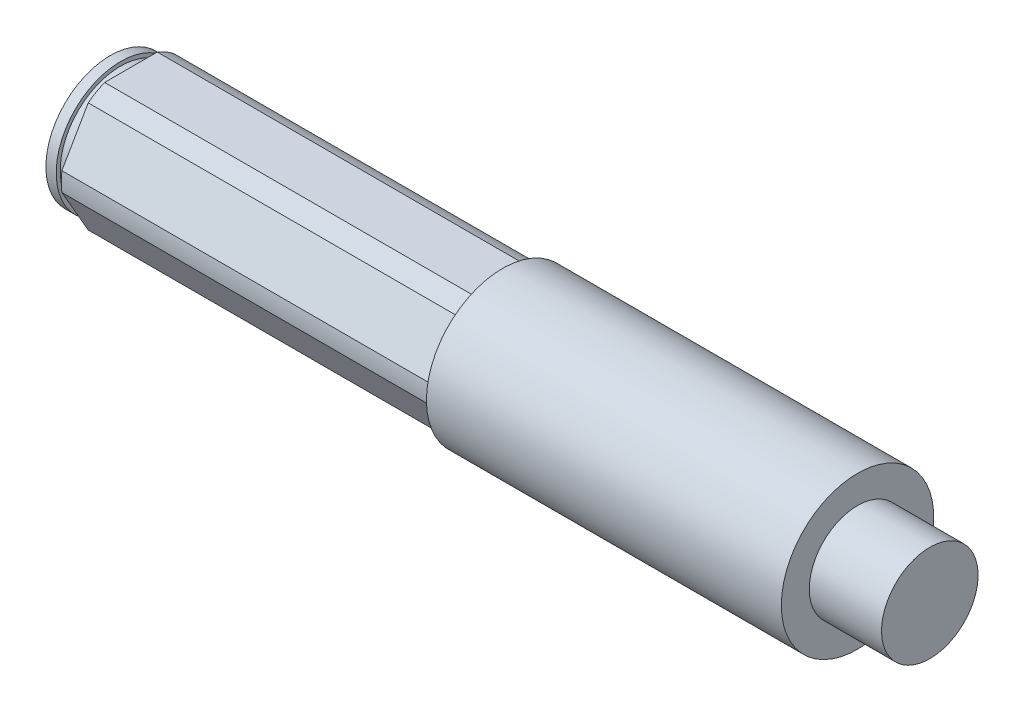
ISO-10303-21;
HEADER;
FILE_DESCRIPTION(('STEP AP214'),'2;1');
FILE_NAME('part.step','',(''),(''),'','','');
FILE_SCHEMA(('AUTOMOTIVE_DESIGN { 1 0 10303 214 1 1 1 1 }'));
ENDSEC;
DATA;
#1=APPLICATION_CONTEXT('core data for automotive mechanical design processes');
#2=APPLICATION_PROTOCOL_DEFINITION('international standard','automotive_design',2000,#1);
#3=PRODUCT_CONTEXT('',#1,'mechanical');
#4=PRODUCT('Part','Part','',(#3));
#5=PRODUCT_RELATED_PRODUCT_CATEGORY('part','',(#4));
#6=PRODUCT_DEFINITION_FORMATION('','',#4);
#7=PRODUCT_DEFINITION_CONTEXT('part definition',#1,'design');
#8=PRODUCT_DEFINITION('design','',#6,#7);
#9=PRODUCT_DEFINITION_SHAPE('','',#8);
#10=(LENGTH_UNIT() NAMED_UNIT(*) SI_UNIT(.MILLI.,.METRE.));
#11=(NAMED_UNIT(*) PLANE_ANGLE_UNIT() SI_UNIT($,.RADIAN.));
#12=(NAMED_UNIT(*) SI_UNIT($,.STERADIAN.) SOLID_ANGLE_UNIT());
#13=UNCERTAINTY_MEASURE_WITH_UNIT(LENGTH_MEASURE(1.E-05),#10,'distance_accuracy_value','');
#14=(GEOMETRIC_REPRESENTATION_CONTEXT(3) GLOBAL_UNCERTAINTY_ASSIGNED_CONTEXT((#13)) GLOBAL_UNIT_ASSIGNED_CONTEXT((#10,
#11,#12)) REPRESENTATION_CONTEXT('',''));
#15=CARTESIAN_POINT('',(0.,0.,0.));
#16=DIRECTION('',(0.,0.,1.));
#17=DIRECTION('',(1.,0.,0.));
#18=AXIS2_PLACEMENT_3D('',#15,#16,#17);
#19=CARTESIAN_POINT('',(-56.0705,0.,0.));
#20=DIRECTION('',(-1.,0.,0.));
#21=DIRECTION('',(0.,0.,1.));
#22=AXIS2_PLACEMENT_3D('',#19,#20,#21);
#23=PLANE('',#22);
#24=CARTESIAN_POINT('',(-56.0705,0.,0.));
#25=DIRECTION('',(1.,0.,0.));
#26=DIRECTION('',(0.,0.,-1.));
#27=AXIS2_PLACEMENT_3D('',#24,#25,#26);
#28=CIRCLE('',#27,6.3373);
#29=CARTESIAN_POINT('',(-56.0705,0.,-6.3373));
#30=VERTEX_POINT('',#29);
#31=EDGE_CURVE('E19',#30,#30,#28,.T.);
#32=ORIENTED_EDGE('',*,*,#31,.F.);
#33=EDGE_LOOP('',(#32));
#34=FACE_BOUND('',#33,.T.);
#35=ADVANCED_FACE('F16',(#34),#23,.T.);
#36=CARTESIAN_POINT('',(-56.0705,0.,0.));
#37=DIRECTION('',(1.,0.,0.));
#38=DIRECTION('',(0.,0.,-1.));
#39=AXIS2_PLACEMENT_3D('',#36,#37,#38);
#40=CYLINDRICAL_SURFACE('',#39,6.3373);
#41=ORIENTED_EDGE('',*,*,#31,.T.);
#42=EDGE_LOOP('',(#41));
#43=FACE_BOUND('',#42,.T.);
#44=CARTESIAN_POINT('',(-55.0545,0.,0.));
#45=DIRECTION('',(1.,0.,0.));
#46=DIRECTION('',(0.,0.,-1.));
#47=AXIS2_PLACEMENT_3D('',#44,#45,#46);
#48=CIRCLE('',#47,6.3373);
#49=CARTESIAN_POINT('',(-55.0545,0.,-6.3373));
#50=VERTEX_POINT('',#49);
#51=EDGE_CURVE('E279',#50,#50,#48,.F.);
#52=ORIENTED_EDGE('',*,*,#51,.T.);
#53=EDGE_LOOP('',(#52));
#54=FACE_BOUND('',#53,.T.);
#55=ADVANCED_FACE('F288',(#43,#54),#40,.T.);
#56=CARTESIAN_POINT('',(-55.0545,0.,0.));
#57=DIRECTION('',(-1.,0.,0.));
#58=DIRECTION('',(0.,0.,1.));
#59=AXIS2_PLACEMENT_3D('',#56,#57,#58);
#60=PLANE('',#59);
#61=ORIENTED_EDGE('',*,*,#51,.F.);
#62=EDGE_LOOP('',(#61));
#63=FACE_BOUND('',#62,.T.);
#64=CARTESIAN_POINT('',(-55.0545,0.,0.));
#65=DIRECTION('',(1.,0.,0.));
#66=DIRECTION('',(0.,0.,-1.));
#67=AXIS2_PLACEMENT_3D('',#64,#65,#66);
#68=CIRCLE('',#67,5.9436);
#69=CARTESIAN_POINT('',(-55.0545,0.,-5.9436));
#70=VERTEX_POINT('',#69);
#71=EDGE_CURVE('E142',#70,#70,#68,.T.);
#72=ORIENTED_EDGE('',*,*,#71,.F.);
#73=EDGE_LOOP('',(#72));
#74=FACE_BOUND('',#73,.T.);
#75=ADVANCED_FACE('F295',(#63,#74),#60,.F.);
#76=CARTESIAN_POINT('',(-55.0545,0.,0.));
#77=DIRECTION('',(1.,0.,0.));
#78=DIRECTION('',(0.,0.,-1.));
#79=AXIS2_PLACEMENT_3D('',#76,#77,#78);
#80=CYLINDRICAL_SURFACE('',#79,5.9436);
#81=CARTESIAN_POINT('',(-54.0385,0.,0.));
#82=DIRECTION('',(1.,0.,0.));
#83=DIRECTION('',(0.,0.,-1.));
#84=AXIS2_PLACEMENT_3D('',#81,#82,#83);
#85=CIRCLE('',#84,5.9436);
#86=CARTESIAN_POINT('',(-54.0385,0.,-5.9436));
#87=VERTEX_POINT('',#86);
#88=EDGE_CURVE('E141',#87,#87,#85,.T.);
#89=ORIENTED_EDGE('',*,*,#88,.F.);
#90=EDGE_LOOP('',(#89));
#91=FACE_BOUND('',#90,.T.);
#92=ORIENTED_EDGE('',*,*,#71,.T.);
#93=EDGE_LOOP('',(#92));
#94=FACE_BOUND('',#93,.T.);
#95=ADVANCED_FACE('F365',(#91,#94),#80,.T.);
#96=CARTESIAN_POINT('',(24.5745,0.,0.));
#97=DIRECTION('',(1.,0.,0.));
#98=DIRECTION('',(0.,0.,-1.));
#99=AXIS2_PLACEMENT_3D('',#96,#97,#98);
#100=PLANE('',#99);
#101=CARTESIAN_POINT('',(24.5745,0.,0.));
#102=DIRECTION('',(-1.,0.,0.));
#103=DIRECTION('',(0.,0.,1.));
#104=AXIS2_PLACEMENT_3D('',#101,#102,#103);
#105=CIRCLE('',#104,4.7498);
#106=CARTESIAN_POINT('',(24.5745,0.,4.7498));
#107=VERTEX_POINT('',#106);
#108=EDGE_CURVE('E268',#107,#107,#105,.T.);
#109=ORIENTED_EDGE('',*,*,#108,.F.);
#110=EDGE_LOOP('',(#109));
#111=FACE_BOUND('',#110,.T.);
#112=ADVANCED_FACE('F362',(#111),#100,.T.);
#113=CARTESIAN_POINT('',(-54.0385,0.,0.));
#114=DIRECTION('',(1.,0.,0.));
#115=DIRECTION('',(0.,0.,-1.));
#116=AXIS2_PLACEMENT_3D('',#113,#114,#115);
#117=CYLINDRICAL_SURFACE('',#116,6.858);
#118=CARTESIAN_POINT('',(-17.4625,0.,0.));
#119=DIRECTION('',(1.,0.,0.));
#120=DIRECTION('',(0.,0.,-1.));
#121=AXIS2_PLACEMENT_3D('',#118,#119,#120);
#122=CIRCLE('',#121,6.858);
#123=CARTESIAN_POINT('',(-17.4625,0.931732739952725,-6.79441227048375));
#124=VERTEX_POINT('',#123);
#125=CARTESIAN_POINT('',(-17.4625,-0.931732739952729,-6.79441227048375));
#126=VERTEX_POINT('',#125);
#127=EDGE_CURVE('E129',#124,#126,#122,.F.);
#128=ORIENTED_EDGE('',*,*,#127,.T.);
#129=DIRECTION('',(1.,0.,0.));
#130=VECTOR('',#129,1.);
#131=CARTESIAN_POINT('',(-54.0385,-0.93173273995273,-6.79441227048375));
#132=LINE('',#131,#130);
#133=CARTESIAN_POINT('',(-54.0385,-0.931732739952731,-6.79441227048375));
#134=VERTEX_POINT('',#133);
#135=EDGE_CURVE('E153',#126,#134,#132,.F.);
#136=ORIENTED_EDGE('',*,*,#135,.T.);
#137=CARTESIAN_POINT('',(-54.0385,0.,0.));
#138=DIRECTION('',(1.,0.,0.));
#139=DIRECTION('',(0.,0.,-1.));
#140=AXIS2_PLACEMENT_3D('',#137,#138,#139);
#141=CIRCLE('',#140,6.858);
#142=CARTESIAN_POINT('',(-54.0385,0.931732739952723,-6.79441227048375));
#143=VERTEX_POINT('',#142);
#144=EDGE_CURVE('E148',#143,#134,#141,.F.);
#145=ORIENTED_EDGE('',*,*,#144,.F.);
#146=DIRECTION('',(1.,0.,0.));
#147=VECTOR('',#146,1.);
#148=CARTESIAN_POINT('',(-54.0385,0.931732739952723,-6.79441227048375));
#149=LINE('',#148,#147);
#150=EDGE_CURVE('E145',#143,#124,#149,.T.);
#151=ORIENTED_EDGE('',*,*,#150,.T.);
#152=EDGE_LOOP('',(#128,#136,#145,#151));
#153=FACE_BOUND('',#152,.T.);
#154=ADVANCED_FACE('F146',(#153),#117,.T.);
#155=CARTESIAN_POINT('',(-54.0385,0.,0.));
#156=DIRECTION('',(-1.,0.,0.));
#157=DIRECTION('',(0.,0.,1.));
#158=AXIS2_PLACEMENT_3D('',#155,#156,#157);
#159=PLANE('',#158);
#160=DIRECTION('',(0.,0.866025403784439,0.5));
#161=VECTOR('',#160,1.);
#162=CARTESIAN_POINT('',(-54.0385,-3.175,5.49926131403119));
#163=LINE('',#162,#161);
#164=CARTESIAN_POINT('',(-54.0385,-5.41826726004727,4.20411035757862));
#165=VERTEX_POINT('',#164);
#166=CARTESIAN_POINT('',(-54.0385,-0.93173273995272,6.79441227048375));
#167=VERTEX_POINT('',#166);
#168=EDGE_CURVE('E191',#165,#167,#163,.T.);
#169=ORIENTED_EDGE('',*,*,#168,.T.);
#170=CARTESIAN_POINT('',(-54.0385,0.,0.));
#171=DIRECTION('',(1.,0.,0.));
#172=DIRECTION('',(0.,0.,-1.));
#173=AXIS2_PLACEMENT_3D('',#170,#171,#172);
#174=CIRCLE('',#173,6.858);
#175=CARTESIAN_POINT('',(-54.0385,0.931732739952726,6.79441227048375));
#176=VERTEX_POINT('',#175);
#177=EDGE_CURVE('E186',#176,#167,#174,.T.);
#178=ORIENTED_EDGE('',*,*,#177,.F.);
#179=DIRECTION('',(0.,0.866025403784439,-0.5));
#180=VECTOR('',#179,1.);
#181=CARTESIAN_POINT('',(-54.0385,3.175,5.49926131403118));
#182=LINE('',#181,#180);
#183=CARTESIAN_POINT('',(-54.0385,5.41826726004728,4.20411035757862));
#184=VERTEX_POINT('',#183);
#185=EDGE_CURVE('E178',#176,#184,#182,.T.);
#186=ORIENTED_EDGE('',*,*,#185,.T.);
#187=CARTESIAN_POINT('',(-54.0385,0.,0.));
#188=DIRECTION('',(1.,0.,0.));
#189=DIRECTION('',(0.,0.,-1.));
#190=AXIS2_PLACEMENT_3D('',#187,#188,#189);
#191=CIRCLE('',#190,6.858);
#192=CARTESIAN_POINT('',(-54.0385,6.35,2.59030191290513));
#193=VERTEX_POINT('',#192);
#194=EDGE_CURVE('E222',#193,#184,#191,.T.);
#195=ORIENTED_EDGE('',*,*,#194,.F.);
#196=DIRECTION('',(0.,0.,-1.));
#197=VECTOR('',#196,1.);
#198=CARTESIAN_POINT('',(-54.0385,6.35,0.));
#199=LINE('',#198,#197);
#200=CARTESIAN_POINT('',(-54.0385,6.35,-2.59030191290513));
#201=VERTEX_POINT('',#200);
#202=EDGE_CURVE('E221',#193,#201,#199,.T.);
#203=ORIENTED_EDGE('',*,*,#202,.T.);
#204=CARTESIAN_POINT('',(-54.0385,0.,0.));
#205=DIRECTION('',(1.,0.,0.));
#206=DIRECTION('',(0.,0.,-1.));
#207=AXIS2_PLACEMENT_3D('',#204,#205,#206);
#208=CIRCLE('',#207,6.858);
#209=CARTESIAN_POINT('',(-54.0385,5.41826726004727,-4.20411035757862));
#210=VERTEX_POINT('',#209);
#211=EDGE_CURVE('E216',#210,#201,#208,.T.);
#212=ORIENTED_EDGE('',*,*,#211,.F.);
#213=DIRECTION('',(0.,-0.866025403784439,-0.499999999999999));
#214=VECTOR('',#213,1.);
#215=CARTESIAN_POINT('',(-54.0385,3.175,-5.49926131403119));
#216=LINE('',#215,#214);
#217=EDGE_CURVE('E154',#210,#143,#216,.T.);
#218=ORIENTED_EDGE('',*,*,#217,.T.);
#219=ORIENTED_EDGE('',*,*,#144,.T.);
#220=DIRECTION('',(0.,-0.866025403784438,0.5));
#221=VECTOR('',#220,1.);
#222=CARTESIAN_POINT('',(-54.0385,-3.175,-5.49926131403118));
#223=LINE('',#222,#221);
#224=CARTESIAN_POINT('',(-54.0385,-5.41826726004728,-4.20411035757862));
#225=VERTEX_POINT('',#224);
#226=EDGE_CURVE('E209',#134,#225,#223,.T.);
#227=ORIENTED_EDGE('',*,*,#226,.T.);
#228=CARTESIAN_POINT('',(-54.0385,0.,0.));
#229=DIRECTION('',(1.,0.,0.));
#230=DIRECTION('',(0.,0.,-1.));
#231=AXIS2_PLACEMENT_3D('',#228,#229,#230);
#232=CIRCLE('',#231,6.858);
#233=CARTESIAN_POINT('',(-54.0385,-6.35,-2.59030191290514));
#234=VERTEX_POINT('',#233);
#235=EDGE_CURVE('E206',#234,#225,#232,.T.);
#236=ORIENTED_EDGE('',*,*,#235,.F.);
#237=DIRECTION('',(0.,0.,1.));
#238=VECTOR('',#237,1.);
#239=CARTESIAN_POINT('',(-54.0385,-6.35,0.));
#240=LINE('',#239,#238);
#241=CARTESIAN_POINT('',(-54.0385,-6.35,2.59030191290514));
#242=VERTEX_POINT('',#241);
#243=EDGE_CURVE('E201',#234,#242,#240,.T.);
#244=ORIENTED_EDGE('',*,*,#243,.T.);
#245=CARTESIAN_POINT('',(-54.0385,0.,0.));
#246=DIRECTION('',(1.,0.,0.));
#247=DIRECTION('',(0.,0.,-1.));
#248=AXIS2_PLACEMENT_3D('',#245,#246,#247);
#249=CIRCLE('',#248,6.858);
#250=EDGE_CURVE('E196',#165,#242,#249,.T.);
#251=ORIENTED_EDGE('',*,*,#250,.F.);
#252=EDGE_LOOP('',(#169,#178,#186,#195,#203,#212,#218,#219,#227,#236,#244,#251));
#253=FACE_BOUND('',#252,.T.);
#254=ORIENTED_EDGE('',*,*,#88,.T.);
#255=EDGE_LOOP('',(#254));
#256=FACE_BOUND('',#255,.T.);
#257=ADVANCED_FACE('F356',(#253,#256),#159,.T.);
#258=CARTESIAN_POINT('',(24.5745,0.,0.));
#259=DIRECTION('',(-1.,0.,0.));
#260=DIRECTION('',(0.,0.,1.));
#261=AXIS2_PLACEMENT_3D('',#258,#259,#260);
#262=CYLINDRICAL_SURFACE('',#261,4.7498);
#263=CARTESIAN_POINT('',(17.4625,0.,0.));
#264=DIRECTION('',(-1.,0.,0.));
#265=DIRECTION('',(0.,0.,1.));
#266=AXIS2_PLACEMENT_3D('',#263,#264,#265);
#267=CIRCLE('',#266,4.7498);
#268=CARTESIAN_POINT('',(17.4625,0.,4.7498));
#269=VERTEX_POINT('',#268);
#270=EDGE_CURVE('E183',#269,#269,#267,.T.);
#271=ORIENTED_EDGE('',*,*,#270,.F.);
#272=EDGE_LOOP('',(#271));
#273=FACE_BOUND('',#272,.T.);
#274=ORIENTED_EDGE('',*,*,#108,.T.);
#275=EDGE_LOOP('',(#274));
#276=FACE_BOUND('',#275,.T.);
#277=ADVANCED_FACE('F352',(#273,#276),#262,.T.);
#278=CARTESIAN_POINT('',(-54.0385,0.,0.));
#279=DIRECTION('',(1.,0.,0.));
#280=DIRECTION('',(0.,0.,-1.));
#281=AXIS2_PLACEMENT_3D('',#278,#279,#280);
#282=CYLINDRICAL_SURFACE('',#281,6.858);
#283=ORIENTED_EDGE('',*,*,#194,.T.);
#284=DIRECTION('',(1.,0.,0.));
#285=VECTOR('',#284,1.);
#286=CARTESIAN_POINT('',(-54.0385,5.41826726004728,4.20411035757862));
#287=LINE('',#286,#285);
#288=CARTESIAN_POINT('',(-17.4625,5.41826726004727,4.20411035757862));
#289=VERTEX_POINT('',#288);
#290=EDGE_CURVE('E180',#184,#289,#287,.T.);
#291=ORIENTED_EDGE('',*,*,#290,.T.);
#292=CARTESIAN_POINT('',(-17.4625,0.,0.));
#293=DIRECTION('',(1.,0.,0.));
#294=DIRECTION('',(0.,0.,-1.));
#295=AXIS2_PLACEMENT_3D('',#292,#293,#294);
#296=CIRCLE('',#295,6.858);
#297=CARTESIAN_POINT('',(-17.4625,6.35,2.59030191290513));
#298=VERTEX_POINT('',#297);
#299=EDGE_CURVE('E174',#289,#298,#296,.F.);
#300=ORIENTED_EDGE('',*,*,#299,.T.);
#301=DIRECTION('',(1.,0.,0.));
#302=VECTOR('',#301,1.);
#303=CARTESIAN_POINT('',(-54.0385,6.35,2.59030191290513));
#304=LINE('',#303,#302);
#305=EDGE_CURVE('E217',#298,#193,#304,.F.);
#306=ORIENTED_EDGE('',*,*,#305,.T.);
#307=EDGE_LOOP('',(#283,#291,#300,#306));
#308=FACE_BOUND('',#307,.T.);
#309=ADVANCED_FACE('F348',(#308),#282,.T.);
#310=CARTESIAN_POINT('',(-54.0385,6.35,0.));
#311=DIRECTION('',(0.,-1.,0.));
#312=DIRECTION('',(0.,0.,-1.));
#313=AXIS2_PLACEMENT_3D('',#310,#311,#312);
#314=PLANE('',#313);
#315=DIRECTION('',(1.,0.,0.));
#316=VECTOR('',#315,1.);
#317=CARTESIAN_POINT('',(-54.0385,6.35,-2.59030191290514));
#318=LINE('',#317,#316);
#319=CARTESIAN_POINT('',(-17.4625,6.35,-2.59030191290513));
#320=VERTEX_POINT('',#319);
#321=EDGE_CURVE('E211',#201,#320,#318,.T.);
#322=ORIENTED_EDGE('',*,*,#321,.F.);
#323=ORIENTED_EDGE('',*,*,#202,.F.);
#324=ORIENTED_EDGE('',*,*,#305,.F.);
#325=DIRECTION('',(0.,0.,-1.));
#326=VECTOR('',#325,1.);
#327=CARTESIAN_POINT('',(-17.4625,6.35,0.));
#328=LINE('',#327,#326);
#329=EDGE_CURVE('E168',#298,#320,#328,.T.);
#330=ORIENTED_EDGE('',*,*,#329,.T.);
#331=EDGE_LOOP('',(#322,#323,#324,#330));
#332=FACE_BOUND('',#331,.T.);
#333=ADVANCED_FACE('F344',(#332),#314,.F.);
#334=CARTESIAN_POINT('',(-54.0385,0.,0.));
#335=DIRECTION('',(1.,0.,0.));
#336=DIRECTION('',(0.,0.,-1.));
#337=AXIS2_PLACEMENT_3D('',#334,#335,#336);
#338=CYLINDRICAL_SURFACE('',#337,6.858);
#339=ORIENTED_EDGE('',*,*,#211,.T.);
#340=ORIENTED_EDGE('',*,*,#321,.T.);
#341=CARTESIAN_POINT('',(-17.4625,0.,0.));
#342=DIRECTION('',(1.,0.,0.));
#343=DIRECTION('',(0.,0.,-1.));
#344=AXIS2_PLACEMENT_3D('',#341,#342,#343);
#345=CIRCLE('',#344,6.858);
#346=CARTESIAN_POINT('',(-17.4625,5.41826726004727,-4.20411035757863));
#347=VERTEX_POINT('',#346);
#348=EDGE_CURVE('E161',#320,#347,#345,.F.);
#349=ORIENTED_EDGE('',*,*,#348,.T.);
#350=DIRECTION('',(1.,0.,0.));
#351=VECTOR('',#350,1.);
#352=CARTESIAN_POINT('',(-54.0385,5.41826726004727,-4.20411035757862));
#353=LINE('',#352,#351);
#354=EDGE_CURVE('E159',#347,#210,#353,.F.);
#355=ORIENTED_EDGE('',*,*,#354,.T.);
#356=EDGE_LOOP('',(#339,#340,#349,#355));
#357=FACE_BOUND('',#356,.T.);
#358=ADVANCED_FACE('F341',(#357),#338,.T.);
#359=CARTESIAN_POINT('',(-54.0385,3.175,-5.49926131403119));
#360=DIRECTION('',(0.,-0.499999999999999,0.866025403784439));
#361=DIRECTION('',(0.,-0.866025403784439,-0.499999999999999));
#362=AXIS2_PLACEMENT_3D('',#359,#360,#361);
#363=PLANE('',#362);
#364=ORIENTED_EDGE('',*,*,#150,.F.);
#365=ORIENTED_EDGE('',*,*,#217,.F.);
#366=ORIENTED_EDGE('',*,*,#354,.F.);
#367=DIRECTION('',(0.,-0.866025403784439,-0.499999999999999));
#368=VECTOR('',#367,1.);
#369=CARTESIAN_POINT('',(-17.4625,5.41826726004727,-4.20411035757863));
#370=LINE('',#369,#368);
#371=EDGE_CURVE('E137',#347,#124,#370,.T.);
#372=ORIENTED_EDGE('',*,*,#371,.T.);
#373=EDGE_LOOP('',(#364,#365,#366,#372));
#374=FACE_BOUND('',#373,.T.);
#375=ADVANCED_FACE('F157',(#374),#363,.F.);
#376=CARTESIAN_POINT('',(-54.0385,-3.175,-5.49926131403118));
#377=DIRECTION('',(0.,0.5,0.866025403784438));
#378=DIRECTION('',(0.,-0.866025403784438,0.5));
#379=AXIS2_PLACEMENT_3D('',#376,#377,#378);
#380=PLANE('',#379);
#381=DIRECTION('',(1.,0.,0.));
#382=VECTOR('',#381,1.);
#383=CARTESIAN_POINT('',(-54.0385,-5.41826726004728,-4.20411035757861));
#384=LINE('',#383,#382);
#385=CARTESIAN_POINT('',(-17.4625,-5.41826726004728,-4.20411035757862));
#386=VERTEX_POINT('',#385);
#387=EDGE_CURVE('E202',#225,#386,#384,.T.);
#388=ORIENTED_EDGE('',*,*,#387,.F.);
#389=ORIENTED_EDGE('',*,*,#226,.F.);
#390=ORIENTED_EDGE('',*,*,#135,.F.);
#391=DIRECTION('',(0.,-0.866025403784439,0.5));
#392=VECTOR('',#391,1.);
#393=CARTESIAN_POINT('',(-17.4625,-0.931732739952729,-6.79441227048375));
#394=LINE('',#393,#392);
#395=EDGE_CURVE('E139',#126,#386,#394,.T.);
#396=ORIENTED_EDGE('',*,*,#395,.T.);
#397=EDGE_LOOP('',(#388,#389,#390,#396));
#398=FACE_BOUND('',#397,.T.);
#399=ADVANCED_FACE('F335',(#398),#380,.F.);
#400=CARTESIAN_POINT('',(-54.0385,0.,0.));
#401=DIRECTION('',(1.,0.,0.));
#402=DIRECTION('',(0.,0.,-1.));
#403=AXIS2_PLACEMENT_3D('',#400,#401,#402);
#404=CYLINDRICAL_SURFACE('',#403,6.858);
#405=ORIENTED_EDGE('',*,*,#235,.T.);
#406=ORIENTED_EDGE('',*,*,#387,.T.);
#407=CARTESIAN_POINT('',(-17.4625,0.,0.));
#408=DIRECTION('',(1.,0.,0.));
#409=DIRECTION('',(0.,0.,-1.));
#410=AXIS2_PLACEMENT_3D('',#407,#408,#409);
#411=CIRCLE('',#410,6.858);
#412=CARTESIAN_POINT('',(-17.4625,-6.35,-2.59030191290513));
#413=VERTEX_POINT('',#412);
#414=EDGE_CURVE('E165',#386,#413,#411,.F.);
#415=ORIENTED_EDGE('',*,*,#414,.T.);
#416=DIRECTION('',(1.,0.,0.));
#417=VECTOR('',#416,1.);
#418=CARTESIAN_POINT('',(-54.0385,-6.35,-2.59030191290514));
#419=LINE('',#418,#417);
#420=EDGE_CURVE('E197',#413,#234,#419,.F.);
#421=ORIENTED_EDGE('',*,*,#420,.T.);
#422=EDGE_LOOP('',(#405,#406,#415,#421));
#423=FACE_BOUND('',#422,.T.);
#424=ADVANCED_FACE('F331',(#423),#404,.T.);
#425=CARTESIAN_POINT('',(-54.0385,-6.35,0.));
#426=DIRECTION('',(0.,1.,0.));
#427=DIRECTION('',(0.,0.,1.));
#428=AXIS2_PLACEMENT_3D('',#425,#426,#427);
#429=PLANE('',#428);
#430=DIRECTION('',(1.,0.,0.));
#431=VECTOR('',#430,1.);
#432=CARTESIAN_POINT('',(-54.0385,-6.35,2.59030191290514));
#433=LINE('',#432,#431);
#434=CARTESIAN_POINT('',(-17.4625,-6.35,2.59030191290514));
#435=VERTEX_POINT('',#434);
#436=EDGE_CURVE('E192',#242,#435,#433,.T.);
#437=ORIENTED_EDGE('',*,*,#436,.F.);
#438=ORIENTED_EDGE('',*,*,#243,.F.);
#439=ORIENTED_EDGE('',*,*,#420,.F.);
#440=DIRECTION('',(0.,0.,-1.));
#441=VECTOR('',#440,1.);
#442=CARTESIAN_POINT('',(-17.4625,-6.35,0.));
#443=LINE('',#442,#441);
#444=EDGE_CURVE('E245',#413,#435,#443,.F.);
#445=ORIENTED_EDGE('',*,*,#444,.T.);
#446=EDGE_LOOP('',(#437,#438,#439,#445));
#447=FACE_BOUND('',#446,.T.);
#448=ADVANCED_FACE('F327',(#447),#429,.F.);
#449=CARTESIAN_POINT('',(-54.0385,0.,0.));
#450=DIRECTION('',(1.,0.,0.));
#451=DIRECTION('',(0.,0.,-1.));
#452=AXIS2_PLACEMENT_3D('',#449,#450,#451);
#453=CYLINDRICAL_SURFACE('',#452,6.858);
#454=ORIENTED_EDGE('',*,*,#250,.T.);
#455=ORIENTED_EDGE('',*,*,#436,.T.);
#456=CARTESIAN_POINT('',(-17.4625,0.,0.));
#457=DIRECTION('',(1.,0.,0.));
#458=DIRECTION('',(0.,0.,-1.));
#459=AXIS2_PLACEMENT_3D('',#456,#457,#458);
#460=CIRCLE('',#459,6.858);
#461=CARTESIAN_POINT('',(-17.4625,-5.41826726004727,4.20411035757862));
#462=VERTEX_POINT('',#461);
#463=EDGE_CURVE('E242',#435,#462,#460,.F.);
#464=ORIENTED_EDGE('',*,*,#463,.T.);
#465=DIRECTION('',(1.,0.,0.));
#466=VECTOR('',#465,1.);
#467=CARTESIAN_POINT('',(-54.0385,-5.41826726004727,4.20411035757862));
#468=LINE('',#467,#466);
#469=EDGE_CURVE('E187',#462,#165,#468,.F.);
#470=ORIENTED_EDGE('',*,*,#469,.T.);
#471=EDGE_LOOP('',(#454,#455,#464,#470));
#472=FACE_BOUND('',#471,.T.);
#473=ADVANCED_FACE('F323',(#472),#453,.T.);
#474=CARTESIAN_POINT('',(-54.0385,-3.175,5.49926131403119));
#475=DIRECTION('',(0.,0.5,-0.866025403784439));
#476=DIRECTION('',(0.,0.866025403784439,0.5));
#477=AXIS2_PLACEMENT_3D('',#474,#475,#476);
#478=PLANE('',#477);
#479=DIRECTION('',(1.,0.,0.));
#480=VECTOR('',#479,1.);
#481=CARTESIAN_POINT('',(-54.0385,-0.931732739952719,6.79441227048375));
#482=LINE('',#481,#480);
#483=CARTESIAN_POINT('',(-17.4625,-0.93173273995272,6.79441227048375));
#484=VERTEX_POINT('',#483);
#485=EDGE_CURVE('E179',#167,#484,#482,.T.);
#486=ORIENTED_EDGE('',*,*,#485,.F.);
#487=ORIENTED_EDGE('',*,*,#168,.F.);
#488=ORIENTED_EDGE('',*,*,#469,.F.);
#489=DIRECTION('',(0.,0.866025403784439,0.499999999999999));
#490=VECTOR('',#489,1.);
#491=CARTESIAN_POINT('',(-17.4625,-5.41826726004727,4.20411035757862));
#492=LINE('',#491,#490);
#493=EDGE_CURVE('E241',#462,#484,#492,.T.);
#494=ORIENTED_EDGE('',*,*,#493,.T.);
#495=EDGE_LOOP('',(#486,#487,#488,#494));
#496=FACE_BOUND('',#495,.T.);
#497=ADVANCED_FACE('F320',(#496),#478,.F.);
#498=CARTESIAN_POINT('',(-54.0385,0.,0.));
#499=DIRECTION('',(1.,0.,0.));
#500=DIRECTION('',(0.,0.,-1.));
#501=AXIS2_PLACEMENT_3D('',#498,#499,#500);
#502=CYLINDRICAL_SURFACE('',#501,6.858);
#503=ORIENTED_EDGE('',*,*,#177,.T.);
#504=ORIENTED_EDGE('',*,*,#485,.T.);
#505=CARTESIAN_POINT('',(-17.4625,0.,0.));
#506=DIRECTION('',(1.,0.,0.));
#507=DIRECTION('',(0.,0.,-1.));
#508=AXIS2_PLACEMENT_3D('',#505,#506,#507);
#509=CIRCLE('',#508,6.858);
#510=CARTESIAN_POINT('',(-17.4625,0.931732739952726,6.79441227048375));
#511=VERTEX_POINT('',#510);
#512=EDGE_CURVE('E39',#484,#511,#509,.F.);
#513=ORIENTED_EDGE('',*,*,#512,.T.);
#514=DIRECTION('',(1.,0.,0.));
#515=VECTOR('',#514,1.);
#516=CARTESIAN_POINT('',(-54.0385,0.931732739952726,6.79441227048375));
#517=LINE('',#516,#515);
#518=EDGE_CURVE('E175',#511,#176,#517,.F.);
#519=ORIENTED_EDGE('',*,*,#518,.T.);
#520=EDGE_LOOP('',(#503,#504,#513,#519));
#521=FACE_BOUND('',#520,.T.);
#522=ADVANCED_FACE('F316',(#521),#502,.T.);
#523=CARTESIAN_POINT('',(-54.0385,3.175,5.49926131403118));
#524=DIRECTION('',(0.,-0.5,-0.866025403784439));
#525=DIRECTION('',(0.,0.866025403784439,-0.5));
#526=AXIS2_PLACEMENT_3D('',#523,#524,#525);
#527=PLANE('',#526);
#528=ORIENTED_EDGE('',*,*,#290,.F.);
#529=ORIENTED_EDGE('',*,*,#185,.F.);
#530=ORIENTED_EDGE('',*,*,#518,.F.);
#531=DIRECTION('',(0.,0.866025403784439,-0.5));
#532=VECTOR('',#531,1.);
#533=CARTESIAN_POINT('',(-17.4625,0.931732739952726,6.79441227048375));
#534=LINE('',#533,#532);
#535=EDGE_CURVE('E238',#511,#289,#534,.T.);
#536=ORIENTED_EDGE('',*,*,#535,.T.);
#537=EDGE_LOOP('',(#528,#529,#530,#536));
#538=FACE_BOUND('',#537,.T.);
#539=ADVANCED_FACE('F312',(#538),#527,.F.);
#540=CARTESIAN_POINT('',(17.4625,0.,0.));
#541=DIRECTION('',(1.,0.,0.));
#542=DIRECTION('',(0.,0.,-1.));
#543=AXIS2_PLACEMENT_3D('',#540,#541,#542);
#544=PLANE('',#543);
#545=CARTESIAN_POINT('',(17.4625,0.,0.));
#546=DIRECTION('',(-1.,0.,0.));
#547=DIRECTION('',(0.,0.,1.));
#548=AXIS2_PLACEMENT_3D('',#545,#546,#547);
#549=CIRCLE('',#548,7.5);
#550=CARTESIAN_POINT('',(17.4625,0.,7.5));
#551=VERTEX_POINT('',#550);
#552=EDGE_CURVE('E26',#551,#551,#549,.T.);
#553=ORIENTED_EDGE('',*,*,#552,.F.);
#554=EDGE_LOOP('',(#553));
#555=FACE_BOUND('',#554,.T.);
#556=ORIENTED_EDGE('',*,*,#270,.T.);
#557=EDGE_LOOP('',(#556));
#558=FACE_BOUND('',#557,.T.);
#559=ADVANCED_FACE('F305',(#555,#558),#544,.T.);
#560=CARTESIAN_POINT('',(-17.4625,0.,0.));
#561=DIRECTION('',(1.,0.,0.));
#562=DIRECTION('',(0.,0.,-1.));
#563=AXIS2_PLACEMENT_3D('',#560,#561,#562);
#564=PLANE('',#563);
#565=CARTESIAN_POINT('',(-17.4625,0.,0.));
#566=DIRECTION('',(-1.,0.,0.));
#567=DIRECTION('',(0.,0.,1.));
#568=AXIS2_PLACEMENT_3D('',#565,#566,#567);
#569=CIRCLE('',#568,7.5);
#570=CARTESIAN_POINT('',(-17.4625,0.,7.5));
#571=VERTEX_POINT('',#570);
#572=EDGE_CURVE('E11',#571,#571,#569,.F.);
#573=ORIENTED_EDGE('',*,*,#572,.F.);
#574=EDGE_LOOP('',(#573));
#575=FACE_BOUND('',#574,.T.);
#576=ORIENTED_EDGE('',*,*,#512,.F.);
#577=ORIENTED_EDGE('',*,*,#493,.F.);
#578=ORIENTED_EDGE('',*,*,#463,.F.);
#579=ORIENTED_EDGE('',*,*,#444,.F.);
#580=ORIENTED_EDGE('',*,*,#414,.F.);
#581=ORIENTED_EDGE('',*,*,#395,.F.);
#582=ORIENTED_EDGE('',*,*,#127,.F.);
#583=ORIENTED_EDGE('',*,*,#371,.F.);
#584=ORIENTED_EDGE('',*,*,#348,.F.);
#585=ORIENTED_EDGE('',*,*,#329,.F.);
#586=ORIENTED_EDGE('',*,*,#299,.F.);
#587=ORIENTED_EDGE('',*,*,#535,.F.);
#588=EDGE_LOOP('',(#576,#577,#578,#579,#580,#581,#582,#583,#584,#585,#586,#587));
#589=FACE_BOUND('',#588,.T.);
#590=ADVANCED_FACE('F134',(#575,#589),#564,.F.);
#591=CARTESIAN_POINT('',(17.4625,0.,0.));
#592=DIRECTION('',(-1.,0.,0.));
#593=DIRECTION('',(0.,0.,1.));
#594=AXIS2_PLACEMENT_3D('',#591,#592,#593);
#595=CYLINDRICAL_SURFACE('',#594,7.5);
#596=ORIENTED_EDGE('',*,*,#572,.T.);
#597=EDGE_LOOP('',(#596));
#598=FACE_BOUND('',#597,.T.);
#599=ORIENTED_EDGE('',*,*,#552,.T.);
#600=EDGE_LOOP('',(#599));
#601=FACE_BOUND('',#600,.T.);
#602=ADVANCED_FACE('F296',(#598,#601),#595,.T.);
#603=CLOSED_SHELL('',(#35,#55,#75,#95,#112,#154,#257,#277,#309,#333,#358,#375,#399,#424,#448,
#473,#497,#522,#539,#559,#590,#602));
#604=MANIFOLD_SOLID_BREP('B1',#603);
#605=ADVANCED_BREP_SHAPE_REPRESENTATION('',(#18,#604),#14);
#606=SHAPE_DEFINITION_REPRESENTATION(#9,#605);
ENDSEC;
END-ISO-10303-21;
